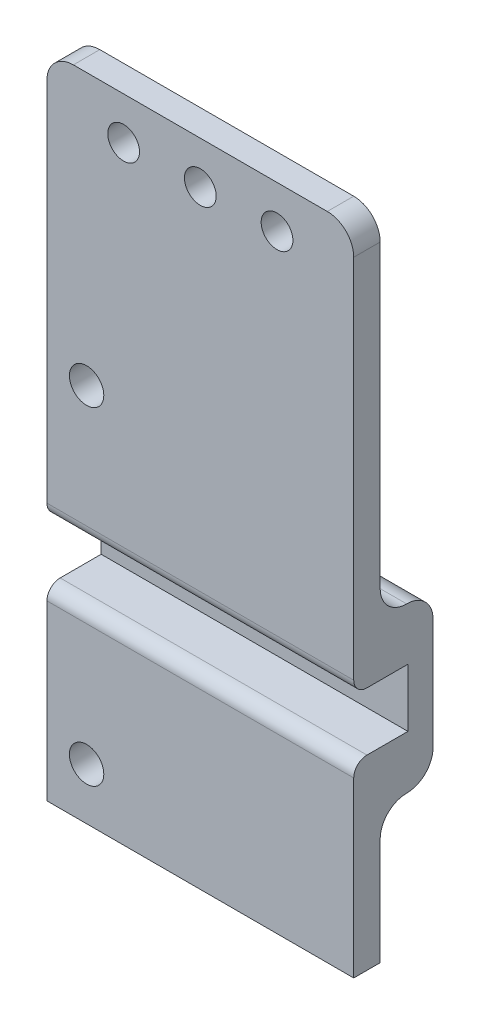
ISO-10303-21;
HEADER;
FILE_DESCRIPTION(('STEP AP214'),'2;1');
FILE_NAME('part.step','',(''),(''),'','','');
FILE_SCHEMA(('AUTOMOTIVE_DESIGN { 1 0 10303 214 1 1 1 1 }'));
ENDSEC;
DATA;
#1=APPLICATION_CONTEXT('core data for automotive mechanical design processes');
#2=APPLICATION_PROTOCOL_DEFINITION('international standard','automotive_design',2000,#1);
#3=PRODUCT_CONTEXT('',#1,'mechanical');
#4=PRODUCT('Part','Part','',(#3));
#5=PRODUCT_RELATED_PRODUCT_CATEGORY('part','',(#4));
#6=PRODUCT_DEFINITION_FORMATION('','',#4);
#7=PRODUCT_DEFINITION_CONTEXT('part definition',#1,'design');
#8=PRODUCT_DEFINITION('design','',#6,#7);
#9=PRODUCT_DEFINITION_SHAPE('','',#8);
#10=(LENGTH_UNIT() NAMED_UNIT(*) SI_UNIT(.MILLI.,.METRE.));
#11=(NAMED_UNIT(*) PLANE_ANGLE_UNIT() SI_UNIT($,.RADIAN.));
#12=(NAMED_UNIT(*) SI_UNIT($,.STERADIAN.) SOLID_ANGLE_UNIT());
#13=UNCERTAINTY_MEASURE_WITH_UNIT(LENGTH_MEASURE(1.E-05),#10,'distance_accuracy_value','');
#14=(GEOMETRIC_REPRESENTATION_CONTEXT(3) GLOBAL_UNCERTAINTY_ASSIGNED_CONTEXT((#13)) GLOBAL_UNIT_ASSIGNED_CONTEXT((#10,
#11,#12)) REPRESENTATION_CONTEXT('',''));
#15=CARTESIAN_POINT('',(0.,0.,0.));
#16=DIRECTION('',(0.,0.,1.));
#17=DIRECTION('',(1.,0.,0.));
#18=AXIS2_PLACEMENT_3D('',#15,#16,#17);
#19=CARTESIAN_POINT('',(0.,-132.,0.));
#20=DIRECTION('',(0.,-1.,0.));
#21=DIRECTION('',(0.,0.,-1.));
#22=AXIS2_PLACEMENT_3D('',#19,#20,#21);
#23=PLANE('',#22);
#24=DIRECTION('',(0.,0.,1.));
#25=VECTOR('',#24,1.);
#26=CARTESIAN_POINT('',(18.9999999999997,-132.,10.));
#27=LINE('',#26,#25);
#28=CARTESIAN_POINT('',(18.9999999999997,-132.,-5.));
#29=VERTEX_POINT('',#28);
#30=CARTESIAN_POINT('',(18.9999999999997,-132.,0.));
#31=VERTEX_POINT('',#30);
#32=EDGE_CURVE('E250',#29,#31,#27,.T.);
#33=ORIENTED_EDGE('',*,*,#32,.T.);
#34=DIRECTION('',(-1.,0.,0.));
#35=VECTOR('',#34,1.);
#36=CARTESIAN_POINT('',(0.,-132.,0.));
#37=LINE('',#36,#35);
#38=CARTESIAN_POINT('',(-39.0000000000003,-132.,0.));
#39=VERTEX_POINT('',#38);
#40=EDGE_CURVE('E414',#31,#39,#37,.T.);
#41=ORIENTED_EDGE('',*,*,#40,.T.);
#42=DIRECTION('',(0.,0.,-1.));
#43=VECTOR('',#42,1.);
#44=CARTESIAN_POINT('',(-39.0000000000003,-132.,10.));
#45=LINE('',#44,#43);
#46=CARTESIAN_POINT('',(-39.0000000000003,-132.,-5.));
#47=VERTEX_POINT('',#46);
#48=EDGE_CURVE('E247',#39,#47,#45,.T.);
#49=ORIENTED_EDGE('',*,*,#48,.T.);
#50=DIRECTION('',(1.,0.,0.));
#51=VECTOR('',#50,1.);
#52=CARTESIAN_POINT('',(-39.0000000000003,-132.,-5.));
#53=LINE('',#52,#51);
#54=EDGE_CURVE('E350',#47,#29,#53,.T.);
#55=ORIENTED_EDGE('',*,*,#54,.T.);
#56=EDGE_LOOP('',(#33,#41,#49,#55));
#57=FACE_BOUND('',#56,.T.);
#58=ADVANCED_FACE('F44',(#57),#23,.T.);
#59=CARTESIAN_POINT('',(18.9999999999997,-29.0000000000002,10.));
#60=DIRECTION('',(-1.,0.,0.));
#61=DIRECTION('',(0.,0.,1.));
#62=AXIS2_PLACEMENT_3D('',#59,#60,#61);
#63=PLANE('',#62);
#64=DIRECTION('',(0.,1.,0.));
#65=VECTOR('',#64,1.);
#66=CARTESIAN_POINT('',(18.9999999999997,-29.0000000000002,0.));
#67=LINE('',#66,#65);
#68=CARTESIAN_POINT('',(18.9999999999997,-99.2500000000003,0.));
#69=VERTEX_POINT('',#68);
#70=EDGE_CURVE('E191',#31,#69,#67,.T.);
#71=ORIENTED_EDGE('',*,*,#70,.F.);
#72=ORIENTED_EDGE('',*,*,#32,.F.);
#73=DIRECTION('',(0.,1.,0.));
#74=VECTOR('',#73,1.);
#75=CARTESIAN_POINT('',(18.9999999999997,-29.0000000000002,-5.));
#76=LINE('',#75,#74);
#77=CARTESIAN_POINT('',(18.9999999999997,-111.75,-5.));
#78=VERTEX_POINT('',#77);
#79=EDGE_CURVE('E353',#29,#78,#76,.T.);
#80=ORIENTED_EDGE('',*,*,#79,.T.);
#81=CARTESIAN_POINT('',(18.9999999999997,-111.75,-10.));
#82=DIRECTION('',(1.,0.,0.));
#83=DIRECTION('',(0.,0.,-1.));
#84=AXIS2_PLACEMENT_3D('',#81,#82,#83);
#85=CIRCLE('',#84,5.);
#86=CARTESIAN_POINT('',(18.9999999999997,-106.75,-10.));
#87=VERTEX_POINT('',#86);
#88=EDGE_CURVE('E317',#87,#78,#85,.T.);
#89=ORIENTED_EDGE('',*,*,#88,.F.);
#90=CARTESIAN_POINT('',(18.9999999999997,-101.75,-10.));
#91=DIRECTION('',(1.,0.,0.));
#92=DIRECTION('',(0.,0.,-1.));
#93=AXIS2_PLACEMENT_3D('',#90,#91,#92);
#94=CIRCLE('',#93,5.);
#95=CARTESIAN_POINT('',(18.9999999999997,-101.75,-15.));
#96=VERTEX_POINT('',#95);
#97=EDGE_CURVE('E299',#96,#87,#94,.F.);
#98=ORIENTED_EDGE('',*,*,#97,.F.);
#99=DIRECTION('',(0.,1.,0.));
#100=VECTOR('',#99,1.);
#101=CARTESIAN_POINT('',(18.9999999999997,-106.75,-15.));
#102=LINE('',#101,#100);
#103=CARTESIAN_POINT('',(18.9999999999997,-80.7500000000003,-15.));
#104=VERTEX_POINT('',#103);
#105=EDGE_CURVE('E368',#96,#104,#102,.T.);
#106=ORIENTED_EDGE('',*,*,#105,.T.);
#107=CARTESIAN_POINT('',(18.9999999999997,-80.7500000000003,-10.));
#108=DIRECTION('',(1.,0.,0.));
#109=DIRECTION('',(0.,0.,-1.));
#110=AXIS2_PLACEMENT_3D('',#107,#108,#109);
#111=CIRCLE('',#110,5.);
#112=CARTESIAN_POINT('',(18.9999999999997,-75.7500000000003,-10.));
#113=VERTEX_POINT('',#112);
#114=EDGE_CURVE('E303',#113,#104,#111,.F.);
#115=ORIENTED_EDGE('',*,*,#114,.F.);
#116=CARTESIAN_POINT('',(18.9999999999997,-70.7500000000003,-10.));
#117=DIRECTION('',(1.,0.,0.));
#118=DIRECTION('',(0.,0.,-1.));
#119=AXIS2_PLACEMENT_3D('',#116,#117,#118);
#120=CIRCLE('',#119,5.);
#121=CARTESIAN_POINT('',(18.9999999999997,-70.7500000000003,-5.));
#122=VERTEX_POINT('',#121);
#123=EDGE_CURVE('E321',#122,#113,#120,.T.);
#124=ORIENTED_EDGE('',*,*,#123,.F.);
#125=DIRECTION('',(0.,1.,0.));
#126=VECTOR('',#125,1.);
#127=CARTESIAN_POINT('',(18.9999999999997,-75.7500000000003,-5.));
#128=LINE('',#127,#126);
#129=CARTESIAN_POINT('',(18.9999999999997,-14.0000000000002,-5.));
#130=VERTEX_POINT('',#129);
#131=EDGE_CURVE('E349',#122,#130,#128,.T.);
#132=ORIENTED_EDGE('',*,*,#131,.T.);
#133=DIRECTION('',(0.,0.,-1.));
#134=VECTOR('',#133,1.);
#135=CARTESIAN_POINT('',(18.9999999999997,-14.0000000000002,10.));
#136=LINE('',#135,#134);
#137=CARTESIAN_POINT('',(18.9999999999997,-14.0000000000002,0.));
#138=VERTEX_POINT('',#137);
#139=EDGE_CURVE('E53',#130,#138,#136,.F.);
#140=ORIENTED_EDGE('',*,*,#139,.T.);
#141=CARTESIAN_POINT('',(18.9999999999997,-83.2500000000003,0.));
#142=VERTEX_POINT('',#141);
#143=EDGE_CURVE('E170',#142,#138,#67,.T.);
#144=ORIENTED_EDGE('',*,*,#143,.F.);
#145=CARTESIAN_POINT('',(18.9999999999997,-83.2500000000003,-2.5));
#146=DIRECTION('',(1.,0.,0.));
#147=DIRECTION('',(0.,0.,-1.));
#148=AXIS2_PLACEMENT_3D('',#145,#146,#147);
#149=CIRCLE('',#148,2.5);
#150=CARTESIAN_POINT('',(18.9999999999997,-85.7500000000003,-2.5));
#151=VERTEX_POINT('',#150);
#152=EDGE_CURVE('E186',#151,#142,#149,.F.);
#153=ORIENTED_EDGE('',*,*,#152,.F.);
#154=DIRECTION('',(0.,0.,-1.));
#155=VECTOR('',#154,1.);
#156=CARTESIAN_POINT('',(18.9999999999997,-85.7500000000003,93.0000000000001));
#157=LINE('',#156,#155);
#158=CARTESIAN_POINT('',(18.9999999999997,-85.7500000000003,-10.25));
#159=VERTEX_POINT('',#158);
#160=EDGE_CURVE('E279',#151,#159,#157,.T.);
#161=ORIENTED_EDGE('',*,*,#160,.T.);
#162=DIRECTION('',(0.,1.,0.));
#163=VECTOR('',#162,1.);
#164=CARTESIAN_POINT('',(18.9999999999997,-29.0000000000002,-10.25));
#165=LINE('',#164,#163);
#166=CARTESIAN_POINT('',(18.9999999999997,-96.7500000000003,-10.25));
#167=VERTEX_POINT('',#166);
#168=EDGE_CURVE('E333',#167,#159,#165,.T.);
#169=ORIENTED_EDGE('',*,*,#168,.F.);
#170=DIRECTION('',(0.,0.,-1.));
#171=VECTOR('',#170,1.);
#172=CARTESIAN_POINT('',(18.9999999999997,-96.7500000000003,93.0000000000001));
#173=LINE('',#172,#171);
#174=CARTESIAN_POINT('',(18.9999999999997,-96.7500000000003,-2.5));
#175=VERTEX_POINT('',#174);
#176=EDGE_CURVE('E364',#175,#167,#173,.T.);
#177=ORIENTED_EDGE('',*,*,#176,.F.);
#178=CARTESIAN_POINT('',(18.9999999999997,-99.2500000000003,-2.5));
#179=DIRECTION('',(1.,0.,0.));
#180=DIRECTION('',(0.,0.,-1.));
#181=AXIS2_PLACEMENT_3D('',#178,#179,#180);
#182=CIRCLE('',#181,2.5);
#183=EDGE_CURVE('E195',#69,#175,#182,.F.);
#184=ORIENTED_EDGE('',*,*,#183,.F.);
#185=EDGE_LOOP('',(#71,#72,#80,#89,#98,#106,#115,#124,#132,#140,#144,#153,#161,#169,#177,#184));
#186=FACE_BOUND('',#185,.T.);
#187=ADVANCED_FACE('F184',(#186),#63,.F.);
#188=CARTESIAN_POINT('',(-39.0000000000003,-29.0000000000002,10.));
#189=DIRECTION('',(1.,0.,0.));
#190=DIRECTION('',(0.,0.,-1.));
#191=AXIS2_PLACEMENT_3D('',#188,#189,#190);
#192=PLANE('',#191);
#193=DIRECTION('',(0.,-1.,0.));
#194=VECTOR('',#193,1.);
#195=CARTESIAN_POINT('',(-39.0000000000003,-29.0000000000002,0.));
#196=LINE('',#195,#194);
#197=CARTESIAN_POINT('',(-39.0000000000003,-14.0000000000002,0.));
#198=VERTEX_POINT('',#197);
#199=CARTESIAN_POINT('',(-39.0000000000003,-83.2500000000003,0.));
#200=VERTEX_POINT('',#199);
#201=EDGE_CURVE('E60',#198,#200,#196,.T.);
#202=ORIENTED_EDGE('',*,*,#201,.F.);
#203=DIRECTION('',(0.,0.,-1.));
#204=VECTOR('',#203,1.);
#205=CARTESIAN_POINT('',(-39.0000000000003,-14.0000000000002,10.));
#206=LINE('',#205,#204);
#207=CARTESIAN_POINT('',(-39.0000000000003,-14.0000000000002,-5.));
#208=VERTEX_POINT('',#207);
#209=EDGE_CURVE('E11',#198,#208,#206,.T.);
#210=ORIENTED_EDGE('',*,*,#209,.T.);
#211=DIRECTION('',(0.,-1.,0.));
#212=VECTOR('',#211,1.);
#213=CARTESIAN_POINT('',(-39.0000000000003,-75.7500000000003,-5.));
#214=LINE('',#213,#212);
#215=CARTESIAN_POINT('',(-39.0000000000003,-70.7500000000003,-5.));
#216=VERTEX_POINT('',#215);
#217=EDGE_CURVE('E346',#208,#216,#214,.T.);
#218=ORIENTED_EDGE('',*,*,#217,.T.);
#219=CARTESIAN_POINT('',(-39.0000000000003,-70.7500000000003,-10.));
#220=DIRECTION('',(-1.,0.,0.));
#221=DIRECTION('',(0.,0.,1.));
#222=AXIS2_PLACEMENT_3D('',#219,#220,#221);
#223=CIRCLE('',#222,5.);
#224=CARTESIAN_POINT('',(-39.0000000000003,-75.7500000000003,-10.));
#225=VERTEX_POINT('',#224);
#226=EDGE_CURVE('E204',#225,#216,#223,.T.);
#227=ORIENTED_EDGE('',*,*,#226,.F.);
#228=CARTESIAN_POINT('',(-39.0000000000003,-80.7500000000003,-10.));
#229=DIRECTION('',(-1.,0.,0.));
#230=DIRECTION('',(0.,0.,1.));
#231=AXIS2_PLACEMENT_3D('',#228,#229,#230);
#232=CIRCLE('',#231,5.);
#233=CARTESIAN_POINT('',(-39.0000000000003,-80.7500000000003,-15.));
#234=VERTEX_POINT('',#233);
#235=EDGE_CURVE('E295',#234,#225,#232,.F.);
#236=ORIENTED_EDGE('',*,*,#235,.F.);
#237=DIRECTION('',(0.,-1.,0.));
#238=VECTOR('',#237,1.);
#239=CARTESIAN_POINT('',(-39.0000000000003,-106.75,-15.));
#240=LINE('',#239,#238);
#241=CARTESIAN_POINT('',(-39.0000000000003,-101.75,-15.));
#242=VERTEX_POINT('',#241);
#243=EDGE_CURVE('E375',#234,#242,#240,.T.);
#244=ORIENTED_EDGE('',*,*,#243,.T.);
#245=CARTESIAN_POINT('',(-39.0000000000003,-101.75,-10.));
#246=DIRECTION('',(-1.,0.,0.));
#247=DIRECTION('',(0.,0.,1.));
#248=AXIS2_PLACEMENT_3D('',#245,#246,#247);
#249=CIRCLE('',#248,5.);
#250=CARTESIAN_POINT('',(-39.0000000000003,-106.75,-10.));
#251=VERTEX_POINT('',#250);
#252=EDGE_CURVE('E291',#251,#242,#249,.F.);
#253=ORIENTED_EDGE('',*,*,#252,.F.);
#254=CARTESIAN_POINT('',(-39.0000000000003,-111.75,-10.));
#255=DIRECTION('',(-1.,0.,0.));
#256=DIRECTION('',(0.,0.,1.));
#257=AXIS2_PLACEMENT_3D('',#254,#255,#256);
#258=CIRCLE('',#257,5.);
#259=CARTESIAN_POINT('',(-39.0000000000003,-111.75,-5.));
#260=VERTEX_POINT('',#259);
#261=EDGE_CURVE('E313',#260,#251,#258,.T.);
#262=ORIENTED_EDGE('',*,*,#261,.F.);
#263=DIRECTION('',(0.,-1.,0.));
#264=VECTOR('',#263,1.);
#265=CARTESIAN_POINT('',(-39.0000000000003,-132.,-5.));
#266=LINE('',#265,#264);
#267=EDGE_CURVE('E330',#260,#47,#266,.T.);
#268=ORIENTED_EDGE('',*,*,#267,.T.);
#269=ORIENTED_EDGE('',*,*,#48,.F.);
#270=CARTESIAN_POINT('',(-39.0000000000003,-99.2500000000003,0.));
#271=VERTEX_POINT('',#270);
#272=EDGE_CURVE('E420',#271,#39,#196,.T.);
#273=ORIENTED_EDGE('',*,*,#272,.F.);
#274=CARTESIAN_POINT('',(-39.0000000000003,-99.2500000000003,-2.5));
#275=DIRECTION('',(-1.,0.,0.));
#276=DIRECTION('',(0.,0.,1.));
#277=AXIS2_PLACEMENT_3D('',#274,#275,#276);
#278=CIRCLE('',#277,2.5);
#279=CARTESIAN_POINT('',(-39.0000000000003,-96.7500000000003,-2.5));
#280=VERTEX_POINT('',#279);
#281=EDGE_CURVE('E178',#280,#271,#278,.F.);
#282=ORIENTED_EDGE('',*,*,#281,.F.);
#283=DIRECTION('',(0.,0.,-1.));
#284=VECTOR('',#283,1.);
#285=CARTESIAN_POINT('',(-39.0000000000003,-96.7500000000003,93.0000000000001));
#286=LINE('',#285,#284);
#287=CARTESIAN_POINT('',(-39.0000000000003,-96.7500000000003,-10.25));
#288=VERTEX_POINT('',#287);
#289=EDGE_CURVE('E363',#280,#288,#286,.T.);
#290=ORIENTED_EDGE('',*,*,#289,.T.);
#291=DIRECTION('',(0.,1.,0.));
#292=VECTOR('',#291,1.);
#293=CARTESIAN_POINT('',(-39.0000000000003,-96.7500000000003,-10.25));
#294=LINE('',#293,#292);
#295=CARTESIAN_POINT('',(-39.0000000000003,-85.7500000000003,-10.25));
#296=VERTEX_POINT('',#295);
#297=EDGE_CURVE('E342',#288,#296,#294,.T.);
#298=ORIENTED_EDGE('',*,*,#297,.T.);
#299=DIRECTION('',(0.,0.,-1.));
#300=VECTOR('',#299,1.);
#301=CARTESIAN_POINT('',(-39.0000000000003,-85.7500000000003,93.0000000000001));
#302=LINE('',#301,#300);
#303=CARTESIAN_POINT('',(-39.0000000000003,-85.7500000000003,-2.5));
#304=VERTEX_POINT('',#303);
#305=EDGE_CURVE('E285',#304,#296,#302,.T.);
#306=ORIENTED_EDGE('',*,*,#305,.F.);
#307=CARTESIAN_POINT('',(-39.0000000000003,-83.2500000000003,-2.5));
#308=DIRECTION('',(-1.,0.,0.));
#309=DIRECTION('',(0.,0.,1.));
#310=AXIS2_PLACEMENT_3D('',#307,#308,#309);
#311=CIRCLE('',#310,2.5);
#312=EDGE_CURVE('E210',#200,#304,#311,.F.);
#313=ORIENTED_EDGE('',*,*,#312,.F.);
#314=EDGE_LOOP('',(#202,#210,#218,#227,#236,#244,#253,#262,#268,#269,#273,#282,#290,#298,#306,#313));
#315=FACE_BOUND('',#314,.T.);
#316=ADVANCED_FACE('F388',(#315),#192,.F.);
#317=CARTESIAN_POINT('',(18.9999999999997,-9.00000000000022,10.));
#318=DIRECTION('',(0.,-1.,0.));
#319=DIRECTION('',(1.,0.,0.));
#320=AXIS2_PLACEMENT_3D('',#317,#318,#319);
#321=PLANE('',#320);
#322=DIRECTION('',(-1.,0.,0.));
#323=VECTOR('',#322,1.);
#324=CARTESIAN_POINT('',(18.9999999999997,-9.00000000000022,0.));
#325=LINE('',#324,#323);
#326=CARTESIAN_POINT('',(13.9999999999997,-9.00000000000022,0.));
#327=VERTEX_POINT('',#326);
#328=CARTESIAN_POINT('',(-34.0000000000003,-9.00000000000022,0.));
#329=VERTEX_POINT('',#328);
#330=EDGE_CURVE('E268',#327,#329,#325,.T.);
#331=ORIENTED_EDGE('',*,*,#330,.F.);
#332=DIRECTION('',(0.,0.,-1.));
#333=VECTOR('',#332,1.);
#334=CARTESIAN_POINT('',(13.9999999999997,-9.00000000000022,10.));
#335=LINE('',#334,#333);
#336=CARTESIAN_POINT('',(13.9999999999997,-9.00000000000022,-5.));
#337=VERTEX_POINT('',#336);
#338=EDGE_CURVE('E258',#327,#337,#335,.T.);
#339=ORIENTED_EDGE('',*,*,#338,.T.);
#340=DIRECTION('',(1.,0.,0.));
#341=VECTOR('',#340,1.);
#342=CARTESIAN_POINT('',(18.9999999999997,-9.00000000000022,-5.));
#343=LINE('',#342,#341);
#344=CARTESIAN_POINT('',(-34.0000000000003,-9.00000000000023,-5.));
#345=VERTEX_POINT('',#344);
#346=EDGE_CURVE('E267',#345,#337,#343,.T.);
#347=ORIENTED_EDGE('',*,*,#346,.F.);
#348=DIRECTION('',(0.,0.,-1.));
#349=VECTOR('',#348,1.);
#350=CARTESIAN_POINT('',(-34.0000000000003,-9.00000000000023,10.));
#351=LINE('',#350,#349);
#352=EDGE_CURVE('E254',#345,#329,#351,.F.);
#353=ORIENTED_EDGE('',*,*,#352,.T.);
#354=EDGE_LOOP('',(#331,#339,#347,#353));
#355=FACE_BOUND('',#354,.T.);
#356=ADVANCED_FACE('F265',(#355),#321,.F.);
#357=CARTESIAN_POINT('',(-24.5000000000003,-17.0000000000002,15.));
#358=DIRECTION('',(0.,0.,-1.));
#359=DIRECTION('',(-1.,0.,0.));
#360=AXIS2_PLACEMENT_3D('',#357,#358,#359);
#361=CYLINDRICAL_SURFACE('',#360,3.);
#362=CARTESIAN_POINT('',(-24.5000000000003,-17.0000000000002,-5.));
#363=DIRECTION('',(0.,0.,-1.));
#364=DIRECTION('',(-1.,0.,0.));
#365=AXIS2_PLACEMENT_3D('',#362,#363,#364);
#366=CIRCLE('',#365,3.);
#367=CARTESIAN_POINT('',(-27.5000000000003,-17.0000000000002,-5.));
#368=VERTEX_POINT('',#367);
#369=EDGE_CURVE('E219',#368,#368,#366,.T.);
#370=ORIENTED_EDGE('',*,*,#369,.T.);
#371=EDGE_LOOP('',(#370));
#372=FACE_BOUND('',#371,.T.);
#373=CARTESIAN_POINT('',(-24.5000000000003,-17.0000000000002,0.));
#374=DIRECTION('',(0.,0.,1.));
#375=DIRECTION('',(1.,0.,0.));
#376=AXIS2_PLACEMENT_3D('',#373,#374,#375);
#377=CIRCLE('',#376,3.);
#378=CARTESIAN_POINT('',(-21.5000000000003,-17.0000000000002,0.));
#379=VERTEX_POINT('',#378);
#380=EDGE_CURVE('E224',#379,#379,#377,.F.);
#381=ORIENTED_EDGE('',*,*,#380,.F.);
#382=EDGE_LOOP('',(#381));
#383=FACE_BOUND('',#382,.T.);
#384=ADVANCED_FACE('F482',(#372,#383),#361,.F.);
#385=CARTESIAN_POINT('',(-10.0000000000003,-17.0000000000002,15.));
#386=DIRECTION('',(0.,0.,-1.));
#387=DIRECTION('',(-1.,0.,0.));
#388=AXIS2_PLACEMENT_3D('',#385,#386,#387);
#389=CYLINDRICAL_SURFACE('',#388,3.);
#390=CARTESIAN_POINT('',(-10.0000000000003,-17.0000000000002,-5.));
#391=DIRECTION('',(0.,0.,-1.));
#392=DIRECTION('',(-1.,0.,0.));
#393=AXIS2_PLACEMENT_3D('',#390,#391,#392);
#394=CIRCLE('',#393,3.);
#395=CARTESIAN_POINT('',(-13.0000000000003,-17.0000000000002,-5.));
#396=VERTEX_POINT('',#395);
#397=EDGE_CURVE('E223',#396,#396,#394,.T.);
#398=ORIENTED_EDGE('',*,*,#397,.T.);
#399=EDGE_LOOP('',(#398));
#400=FACE_BOUND('',#399,.T.);
#401=CARTESIAN_POINT('',(-10.0000000000003,-17.0000000000002,0.));
#402=DIRECTION('',(0.,0.,1.));
#403=DIRECTION('',(1.,0.,0.));
#404=AXIS2_PLACEMENT_3D('',#401,#402,#403);
#405=CIRCLE('',#404,3.);
#406=CARTESIAN_POINT('',(-7.00000000000031,-17.0000000000002,0.));
#407=VERTEX_POINT('',#406);
#408=EDGE_CURVE('E398',#407,#407,#405,.F.);
#409=ORIENTED_EDGE('',*,*,#408,.F.);
#410=EDGE_LOOP('',(#409));
#411=FACE_BOUND('',#410,.T.);
#412=ADVANCED_FACE('F507',(#400,#411),#389,.F.);
#413=CARTESIAN_POINT('',(4.49999999999969,-17.0000000000002,15.));
#414=DIRECTION('',(0.,0.,-1.));
#415=DIRECTION('',(-1.,0.,0.));
#416=AXIS2_PLACEMENT_3D('',#413,#414,#415);
#417=CYLINDRICAL_SURFACE('',#416,3.);
#418=CARTESIAN_POINT('',(4.49999999999969,-17.0000000000002,-5.));
#419=DIRECTION('',(0.,0.,-1.));
#420=DIRECTION('',(-1.,0.,0.));
#421=AXIS2_PLACEMENT_3D('',#418,#419,#420);
#422=CIRCLE('',#421,3.);
#423=CARTESIAN_POINT('',(1.49999999999969,-17.0000000000002,-5.));
#424=VERTEX_POINT('',#423);
#425=EDGE_CURVE('E228',#424,#424,#422,.T.);
#426=ORIENTED_EDGE('',*,*,#425,.T.);
#427=EDGE_LOOP('',(#426));
#428=FACE_BOUND('',#427,.T.);
#429=CARTESIAN_POINT('',(4.49999999999969,-17.0000000000002,0.));
#430=DIRECTION('',(0.,0.,1.));
#431=DIRECTION('',(1.,0.,0.));
#432=AXIS2_PLACEMENT_3D('',#429,#430,#431);
#433=CIRCLE('',#432,3.);
#434=CARTESIAN_POINT('',(7.49999999999969,-17.0000000000002,0.));
#435=VERTEX_POINT('',#434);
#436=EDGE_CURVE('E402',#435,#435,#433,.F.);
#437=ORIENTED_EDGE('',*,*,#436,.F.);
#438=EDGE_LOOP('',(#437));
#439=FACE_BOUND('',#438,.T.);
#440=ADVANCED_FACE('F499',(#428,#439),#417,.F.);
#441=CARTESIAN_POINT('',(-31.4999999999998,-60.2500000000015,15.));
#442=DIRECTION('',(0.,0.,-1.));
#443=DIRECTION('',(-1.,0.,0.));
#444=AXIS2_PLACEMENT_3D('',#441,#442,#443);
#445=CYLINDRICAL_SURFACE('',#444,3.24999999999981);
#446=CARTESIAN_POINT('',(-31.4999999999998,-60.2500000000015,-5.));
#447=DIRECTION('',(0.,0.,-1.));
#448=DIRECTION('',(-1.,0.,0.));
#449=AXIS2_PLACEMENT_3D('',#446,#447,#448);
#450=CIRCLE('',#449,3.24999999999981);
#451=CARTESIAN_POINT('',(-34.7499999999996,-60.2500000000015,-5.));
#452=VERTEX_POINT('',#451);
#453=EDGE_CURVE('E232',#452,#452,#450,.T.);
#454=ORIENTED_EDGE('',*,*,#453,.T.);
#455=EDGE_LOOP('',(#454));
#456=FACE_BOUND('',#455,.T.);
#457=CARTESIAN_POINT('',(-31.4999999999998,-60.2500000000015,0.));
#458=DIRECTION('',(0.,0.,1.));
#459=DIRECTION('',(1.,0.,0.));
#460=AXIS2_PLACEMENT_3D('',#457,#458,#459);
#461=CIRCLE('',#460,3.24999999999981);
#462=CARTESIAN_POINT('',(-28.2499999999999,-60.2500000000015,0.));
#463=VERTEX_POINT('',#462);
#464=EDGE_CURVE('E406',#463,#463,#461,.F.);
#465=ORIENTED_EDGE('',*,*,#464,.F.);
#466=EDGE_LOOP('',(#465));
#467=FACE_BOUND('',#466,.T.);
#468=ADVANCED_FACE('F494',(#456,#467),#445,.F.);
#469=CARTESIAN_POINT('',(-31.499999999999,-122.250000000002,15.));
#470=DIRECTION('',(0.,0.,-1.));
#471=DIRECTION('',(-1.,0.,0.));
#472=AXIS2_PLACEMENT_3D('',#469,#470,#471);
#473=CYLINDRICAL_SURFACE('',#472,3.24999999999981);
#474=CARTESIAN_POINT('',(-31.499999999999,-122.250000000002,-5.));
#475=DIRECTION('',(0.,0.,1.));
#476=DIRECTION('',(1.,0.,0.));
#477=AXIS2_PLACEMENT_3D('',#474,#475,#476);
#478=CIRCLE('',#477,3.24999999999981);
#479=CARTESIAN_POINT('',(-28.2499999999992,-122.250000000002,-5.));
#480=VERTEX_POINT('',#479);
#481=EDGE_CURVE('E236',#480,#480,#478,.T.);
#482=ORIENTED_EDGE('',*,*,#481,.F.);
#483=EDGE_LOOP('',(#482));
#484=FACE_BOUND('',#483,.T.);
#485=CARTESIAN_POINT('',(-31.499999999999,-122.250000000002,0.));
#486=DIRECTION('',(0.,0.,1.));
#487=DIRECTION('',(1.,0.,0.));
#488=AXIS2_PLACEMENT_3D('',#485,#486,#487);
#489=CIRCLE('',#488,3.24999999999981);
#490=CARTESIAN_POINT('',(-28.2499999999992,-122.250000000002,0.));
#491=VERTEX_POINT('',#490);
#492=EDGE_CURVE('E410',#491,#491,#489,.F.);
#493=ORIENTED_EDGE('',*,*,#492,.F.);
#494=EDGE_LOOP('',(#493));
#495=FACE_BOUND('',#494,.T.);
#496=ADVANCED_FACE('F488',(#484,#495),#473,.F.);
#497=CARTESIAN_POINT('',(13.9999999999997,-14.0000000000002,10.));
#498=DIRECTION('',(0.,0.,-1.));
#499=DIRECTION('',(-1.,0.,0.));
#500=AXIS2_PLACEMENT_3D('',#497,#498,#499);
#501=CYLINDRICAL_SURFACE('',#500,5.);
#502=ORIENTED_EDGE('',*,*,#338,.F.);
#503=CARTESIAN_POINT('',(13.9999999999997,-14.0000000000002,0.));
#504=DIRECTION('',(0.,0.,1.));
#505=DIRECTION('',(1.,0.,0.));
#506=AXIS2_PLACEMENT_3D('',#503,#504,#505);
#507=CIRCLE('',#506,5.);
#508=EDGE_CURVE('E421',#327,#138,#507,.F.);
#509=ORIENTED_EDGE('',*,*,#508,.T.);
#510=ORIENTED_EDGE('',*,*,#139,.F.);
#511=CARTESIAN_POINT('',(13.9999999999997,-14.0000000000002,-5.));
#512=DIRECTION('',(0.,0.,-1.));
#513=DIRECTION('',(-1.,0.,0.));
#514=AXIS2_PLACEMENT_3D('',#511,#512,#513);
#515=CIRCLE('',#514,5.);
#516=EDGE_CURVE('E243',#130,#337,#515,.F.);
#517=ORIENTED_EDGE('',*,*,#516,.T.);
#518=EDGE_LOOP('',(#502,#509,#510,#517));
#519=FACE_BOUND('',#518,.T.);
#520=ADVANCED_FACE('F271',(#519),#501,.T.);
#521=CARTESIAN_POINT('',(-34.0000000000003,-14.0000000000002,10.));
#522=DIRECTION('',(0.,0.,-1.));
#523=DIRECTION('',(-1.,0.,0.));
#524=AXIS2_PLACEMENT_3D('',#521,#522,#523);
#525=CYLINDRICAL_SURFACE('',#524,5.);
#526=ORIENTED_EDGE('',*,*,#209,.F.);
#527=CARTESIAN_POINT('',(-34.0000000000003,-14.0000000000002,0.));
#528=DIRECTION('',(0.,0.,1.));
#529=DIRECTION('',(1.,0.,0.));
#530=AXIS2_PLACEMENT_3D('',#527,#528,#529);
#531=CIRCLE('',#530,5.);
#532=EDGE_CURVE('E189',#198,#329,#531,.F.);
#533=ORIENTED_EDGE('',*,*,#532,.T.);
#534=ORIENTED_EDGE('',*,*,#352,.F.);
#535=CARTESIAN_POINT('',(-34.0000000000003,-14.0000000000002,-5.));
#536=DIRECTION('',(0.,0.,-1.));
#537=DIRECTION('',(-1.,0.,0.));
#538=AXIS2_PLACEMENT_3D('',#535,#536,#537);
#539=CIRCLE('',#538,5.);
#540=EDGE_CURVE('E218',#345,#208,#539,.F.);
#541=ORIENTED_EDGE('',*,*,#540,.T.);
#542=EDGE_LOOP('',(#526,#533,#534,#541));
#543=FACE_BOUND('',#542,.T.);
#544=ADVANCED_FACE('F46',(#543),#525,.T.);
#545=CARTESIAN_POINT('',(-39.0000000000003,-85.7500000000003,93.0000000000001));
#546=DIRECTION('',(0.,1.,0.));
#547=DIRECTION('',(0.,0.,-1.));
#548=AXIS2_PLACEMENT_3D('',#545,#546,#547);
#549=PLANE('',#548);
#550=ORIENTED_EDGE('',*,*,#305,.T.);
#551=DIRECTION('',(1.,0.,0.));
#552=VECTOR('',#551,1.);
#553=CARTESIAN_POINT('',(-39.0000000000003,-85.7500000000003,-10.25));
#554=LINE('',#553,#552);
#555=EDGE_CURVE('E337',#296,#159,#554,.T.);
#556=ORIENTED_EDGE('',*,*,#555,.T.);
#557=ORIENTED_EDGE('',*,*,#160,.F.);
#558=DIRECTION('',(-1.,0.,0.));
#559=VECTOR('',#558,1.);
#560=CARTESIAN_POINT('',(-39.0000000000003,-85.7500000000003,-2.5));
#561=LINE('',#560,#559);
#562=EDGE_CURVE('E177',#304,#151,#561,.F.);
#563=ORIENTED_EDGE('',*,*,#562,.F.);
#564=EDGE_LOOP('',(#550,#556,#557,#563));
#565=FACE_BOUND('',#564,.T.);
#566=ADVANCED_FACE('F386',(#565),#549,.F.);
#567=CARTESIAN_POINT('',(0.,0.,-15.));
#568=DIRECTION('',(0.,0.,-1.));
#569=DIRECTION('',(1.,0.,0.));
#570=AXIS2_PLACEMENT_3D('',#567,#568,#569);
#571=PLANE('',#570);
#572=ORIENTED_EDGE('',*,*,#105,.F.);
#573=DIRECTION('',(1.,0.,0.));
#574=VECTOR('',#573,1.);
#575=CARTESIAN_POINT('',(18.9999999999997,-101.75,-15.));
#576=LINE('',#575,#574);
#577=EDGE_CURVE('E278',#242,#96,#576,.T.);
#578=ORIENTED_EDGE('',*,*,#577,.F.);
#579=ORIENTED_EDGE('',*,*,#243,.F.);
#580=DIRECTION('',(-1.,0.,0.));
#581=VECTOR('',#580,1.);
#582=CARTESIAN_POINT('',(-39.0000000000003,-80.7500000000003,-15.));
#583=LINE('',#582,#581);
#584=EDGE_CURVE('E283',#104,#234,#583,.T.);
#585=ORIENTED_EDGE('',*,*,#584,.F.);
#586=EDGE_LOOP('',(#572,#578,#579,#585));
#587=FACE_BOUND('',#586,.T.);
#588=ADVANCED_FACE('F456',(#587),#571,.T.);
#589=CARTESIAN_POINT('',(-39.0000000000003,-96.7500000000003,93.0000000000001));
#590=DIRECTION('',(0.,-1.,0.));
#591=DIRECTION('',(0.,0.,1.));
#592=AXIS2_PLACEMENT_3D('',#589,#590,#591);
#593=PLANE('',#592);
#594=ORIENTED_EDGE('',*,*,#176,.T.);
#595=DIRECTION('',(-1.,0.,0.));
#596=VECTOR('',#595,1.);
#597=CARTESIAN_POINT('',(-39.0000000000003,-96.7500000000003,-10.25));
#598=LINE('',#597,#596);
#599=EDGE_CURVE('E240',#167,#288,#598,.T.);
#600=ORIENTED_EDGE('',*,*,#599,.T.);
#601=ORIENTED_EDGE('',*,*,#289,.F.);
#602=DIRECTION('',(1.,0.,0.));
#603=VECTOR('',#602,1.);
#604=CARTESIAN_POINT('',(-39.0000000000003,-96.7500000000003,-2.5));
#605=LINE('',#604,#603);
#606=EDGE_CURVE('E201',#175,#280,#605,.F.);
#607=ORIENTED_EDGE('',*,*,#606,.F.);
#608=EDGE_LOOP('',(#594,#600,#601,#607));
#609=FACE_BOUND('',#608,.T.);
#610=ADVANCED_FACE('F439',(#609),#593,.F.);
#611=CARTESIAN_POINT('',(0.,0.,-5.));
#612=DIRECTION('',(0.,0.,-1.));
#613=DIRECTION('',(1.,0.,0.));
#614=AXIS2_PLACEMENT_3D('',#611,#612,#613);
#615=PLANE('',#614);
#616=ORIENTED_EDGE('',*,*,#481,.T.);
#617=EDGE_LOOP('',(#616));
#618=FACE_BOUND('',#617,.T.);
#619=ORIENTED_EDGE('',*,*,#79,.F.);
#620=ORIENTED_EDGE('',*,*,#54,.F.);
#621=ORIENTED_EDGE('',*,*,#267,.F.);
#622=DIRECTION('',(-1.,0.,0.));
#623=VECTOR('',#622,1.);
#624=CARTESIAN_POINT('',(0.,-111.75,-5.));
#625=LINE('',#624,#623);
#626=EDGE_CURVE('E307',#78,#260,#625,.T.);
#627=ORIENTED_EDGE('',*,*,#626,.F.);
#628=EDGE_LOOP('',(#619,#620,#621,#627));
#629=FACE_BOUND('',#628,.T.);
#630=ADVANCED_FACE('F448',(#618,#629),#615,.T.);
#631=CARTESIAN_POINT('',(0.,0.,-5.));
#632=DIRECTION('',(0.,0.,1.));
#633=DIRECTION('',(-1.,0.,0.));
#634=AXIS2_PLACEMENT_3D('',#631,#632,#633);
#635=PLANE('',#634);
#636=ORIENTED_EDGE('',*,*,#453,.F.);
#637=EDGE_LOOP('',(#636));
#638=FACE_BOUND('',#637,.T.);
#639=ORIENTED_EDGE('',*,*,#425,.F.);
#640=EDGE_LOOP('',(#639));
#641=FACE_BOUND('',#640,.T.);
#642=ORIENTED_EDGE('',*,*,#397,.F.);
#643=EDGE_LOOP('',(#642));
#644=FACE_BOUND('',#643,.T.);
#645=ORIENTED_EDGE('',*,*,#369,.F.);
#646=EDGE_LOOP('',(#645));
#647=FACE_BOUND('',#646,.T.);
#648=ORIENTED_EDGE('',*,*,#131,.F.);
#649=DIRECTION('',(1.,0.,0.));
#650=VECTOR('',#649,1.);
#651=CARTESIAN_POINT('',(18.9999999999997,-70.7500000000003,-5.));
#652=LINE('',#651,#650);
#653=EDGE_CURVE('E310',#216,#122,#652,.T.);
#654=ORIENTED_EDGE('',*,*,#653,.F.);
#655=ORIENTED_EDGE('',*,*,#217,.F.);
#656=ORIENTED_EDGE('',*,*,#540,.F.);
#657=ORIENTED_EDGE('',*,*,#346,.T.);
#658=ORIENTED_EDGE('',*,*,#516,.F.);
#659=EDGE_LOOP('',(#648,#654,#655,#656,#657,#658));
#660=FACE_BOUND('',#659,.T.);
#661=ADVANCED_FACE('F275',(#638,#641,#644,#647,#660),#635,.F.);
#662=CARTESIAN_POINT('',(0.,-70.7500000000003,-10.));
#663=DIRECTION('',(-1.,0.,0.));
#664=DIRECTION('',(0.,0.,-1.));
#665=AXIS2_PLACEMENT_3D('',#662,#663,#664);
#666=CYLINDRICAL_SURFACE('',#665,5.);
#667=DIRECTION('',(1.,0.,0.));
#668=VECTOR('',#667,1.);
#669=CARTESIAN_POINT('',(-39.0000000000003,-75.7500000000003,-10.));
#670=LINE('',#669,#668);
#671=EDGE_CURVE('E328',#113,#225,#670,.F.);
#672=ORIENTED_EDGE('',*,*,#671,.T.);
#673=ORIENTED_EDGE('',*,*,#226,.T.);
#674=ORIENTED_EDGE('',*,*,#653,.T.);
#675=ORIENTED_EDGE('',*,*,#123,.T.);
#676=EDGE_LOOP('',(#672,#673,#674,#675));
#677=FACE_BOUND('',#676,.T.);
#678=ADVANCED_FACE('F461',(#677),#666,.F.);
#679=CARTESIAN_POINT('',(0.,-80.7500000000003,-10.));
#680=DIRECTION('',(1.,0.,0.));
#681=DIRECTION('',(0.,0.,1.));
#682=AXIS2_PLACEMENT_3D('',#679,#680,#681);
#683=CYLINDRICAL_SURFACE('',#682,5.);
#684=ORIENTED_EDGE('',*,*,#114,.T.);
#685=ORIENTED_EDGE('',*,*,#584,.T.);
#686=ORIENTED_EDGE('',*,*,#235,.T.);
#687=ORIENTED_EDGE('',*,*,#671,.F.);
#688=EDGE_LOOP('',(#684,#685,#686,#687));
#689=FACE_BOUND('',#688,.T.);
#690=ADVANCED_FACE('F458',(#689),#683,.T.);
#691=CARTESIAN_POINT('',(0.,-111.75,-10.));
#692=DIRECTION('',(-1.,0.,0.));
#693=DIRECTION('',(0.,-1.,0.));
#694=AXIS2_PLACEMENT_3D('',#691,#692,#693);
#695=CYLINDRICAL_SURFACE('',#694,5.);
#696=DIRECTION('',(-1.,0.,0.));
#697=VECTOR('',#696,1.);
#698=CARTESIAN_POINT('',(18.9999999999997,-106.75,-10.));
#699=LINE('',#698,#697);
#700=EDGE_CURVE('E331',#251,#87,#699,.F.);
#701=ORIENTED_EDGE('',*,*,#700,.T.);
#702=ORIENTED_EDGE('',*,*,#88,.T.);
#703=ORIENTED_EDGE('',*,*,#626,.T.);
#704=ORIENTED_EDGE('',*,*,#261,.T.);
#705=EDGE_LOOP('',(#701,#702,#703,#704));
#706=FACE_BOUND('',#705,.T.);
#707=ADVANCED_FACE('F449',(#706),#695,.F.);
#708=CARTESIAN_POINT('',(0.,-101.75,-10.));
#709=DIRECTION('',(-1.,0.,0.));
#710=DIRECTION('',(0.,-1.,0.));
#711=AXIS2_PLACEMENT_3D('',#708,#709,#710);
#712=CYLINDRICAL_SURFACE('',#711,5.);
#713=ORIENTED_EDGE('',*,*,#252,.T.);
#714=ORIENTED_EDGE('',*,*,#577,.T.);
#715=ORIENTED_EDGE('',*,*,#97,.T.);
#716=ORIENTED_EDGE('',*,*,#700,.F.);
#717=EDGE_LOOP('',(#713,#714,#715,#716));
#718=FACE_BOUND('',#717,.T.);
#719=ADVANCED_FACE('F454',(#718),#712,.T.);
#720=CARTESIAN_POINT('',(0.,-99.2500000000003,-2.5));
#721=DIRECTION('',(1.,0.,0.));
#722=DIRECTION('',(0.,0.,1.));
#723=AXIS2_PLACEMENT_3D('',#720,#721,#722);
#724=CYLINDRICAL_SURFACE('',#723,2.5);
#725=ORIENTED_EDGE('',*,*,#281,.T.);
#726=DIRECTION('',(1.,0.,0.));
#727=VECTOR('',#726,1.);
#728=CARTESIAN_POINT('',(0.,-99.2500000000003,0.));
#729=LINE('',#728,#727);
#730=EDGE_CURVE('E196',#271,#69,#729,.T.);
#731=ORIENTED_EDGE('',*,*,#730,.T.);
#732=ORIENTED_EDGE('',*,*,#183,.T.);
#733=ORIENTED_EDGE('',*,*,#606,.T.);
#734=EDGE_LOOP('',(#725,#731,#732,#733));
#735=FACE_BOUND('',#734,.T.);
#736=ADVANCED_FACE('F436',(#735),#724,.T.);
#737=CARTESIAN_POINT('',(0.,-83.2500000000003,-2.5));
#738=DIRECTION('',(-1.,0.,0.));
#739=DIRECTION('',(0.,0.,-1.));
#740=AXIS2_PLACEMENT_3D('',#737,#738,#739);
#741=CYLINDRICAL_SURFACE('',#740,2.5);
#742=ORIENTED_EDGE('',*,*,#152,.T.);
#743=DIRECTION('',(-1.,0.,0.));
#744=VECTOR('',#743,1.);
#745=CARTESIAN_POINT('',(0.,-83.2500000000003,0.));
#746=LINE('',#745,#744);
#747=EDGE_CURVE('E166',#142,#200,#746,.T.);
#748=ORIENTED_EDGE('',*,*,#747,.T.);
#749=ORIENTED_EDGE('',*,*,#312,.T.);
#750=ORIENTED_EDGE('',*,*,#562,.T.);
#751=EDGE_LOOP('',(#742,#748,#749,#750));
#752=FACE_BOUND('',#751,.T.);
#753=ADVANCED_FACE('F192',(#752),#741,.T.);
#754=CARTESIAN_POINT('',(0.,0.,-10.25));
#755=DIRECTION('',(0.,0.,-1.));
#756=DIRECTION('',(1.,0.,0.));
#757=AXIS2_PLACEMENT_3D('',#754,#755,#756);
#758=PLANE('',#757);
#759=ORIENTED_EDGE('',*,*,#599,.F.);
#760=ORIENTED_EDGE('',*,*,#168,.T.);
#761=ORIENTED_EDGE('',*,*,#555,.F.);
#762=ORIENTED_EDGE('',*,*,#297,.F.);
#763=EDGE_LOOP('',(#759,#760,#761,#762));
#764=FACE_BOUND('',#763,.T.);
#765=ADVANCED_FACE('F514',(#764),#758,.F.);
#766=CARTESIAN_POINT('',(0.,0.,0.));
#767=DIRECTION('',(0.,0.,1.));
#768=DIRECTION('',(1.,0.,0.));
#769=AXIS2_PLACEMENT_3D('',#766,#767,#768);
#770=PLANE('',#769);
#771=ORIENTED_EDGE('',*,*,#330,.T.);
#772=ORIENTED_EDGE('',*,*,#532,.F.);
#773=ORIENTED_EDGE('',*,*,#201,.T.);
#774=ORIENTED_EDGE('',*,*,#747,.F.);
#775=ORIENTED_EDGE('',*,*,#143,.T.);
#776=ORIENTED_EDGE('',*,*,#508,.F.);
#777=EDGE_LOOP('',(#771,#772,#773,#774,#775,#776));
#778=FACE_BOUND('',#777,.T.);
#779=ORIENTED_EDGE('',*,*,#464,.T.);
#780=EDGE_LOOP('',(#779));
#781=FACE_BOUND('',#780,.T.);
#782=ORIENTED_EDGE('',*,*,#436,.T.);
#783=EDGE_LOOP('',(#782));
#784=FACE_BOUND('',#783,.T.);
#785=ORIENTED_EDGE('',*,*,#408,.T.);
#786=EDGE_LOOP('',(#785));
#787=FACE_BOUND('',#786,.T.);
#788=ORIENTED_EDGE('',*,*,#380,.T.);
#789=EDGE_LOOP('',(#788));
#790=FACE_BOUND('',#789,.T.);
#791=ADVANCED_FACE('F168',(#778,#781,#784,#787,#790),#770,.T.);
#792=ORIENTED_EDGE('',*,*,#70,.T.);
#793=ORIENTED_EDGE('',*,*,#730,.F.);
#794=ORIENTED_EDGE('',*,*,#272,.T.);
#795=ORIENTED_EDGE('',*,*,#40,.F.);
#796=EDGE_LOOP('',(#792,#793,#794,#795));
#797=FACE_BOUND('',#796,.T.);
#798=ORIENTED_EDGE('',*,*,#492,.T.);
#799=EDGE_LOOP('',(#798));
#800=FACE_BOUND('',#799,.T.);
#801=ADVANCED_FACE('F432',(#797,#800),#770,.T.);
#802=CLOSED_SHELL('',(#58,#187,#316,#356,#384,#412,#440,#468,#496,#520,#544,#566,#588,#610,#630,
#661,#678,#690,#707,#719,#736,#753,#765,#791,#801));
#803=MANIFOLD_SOLID_BREP('B2',#802);
#804=ADVANCED_BREP_SHAPE_REPRESENTATION('',(#18,#803),#14);
#805=SHAPE_DEFINITION_REPRESENTATION(#9,#804);
ENDSEC;
END-ISO-10303-21;
